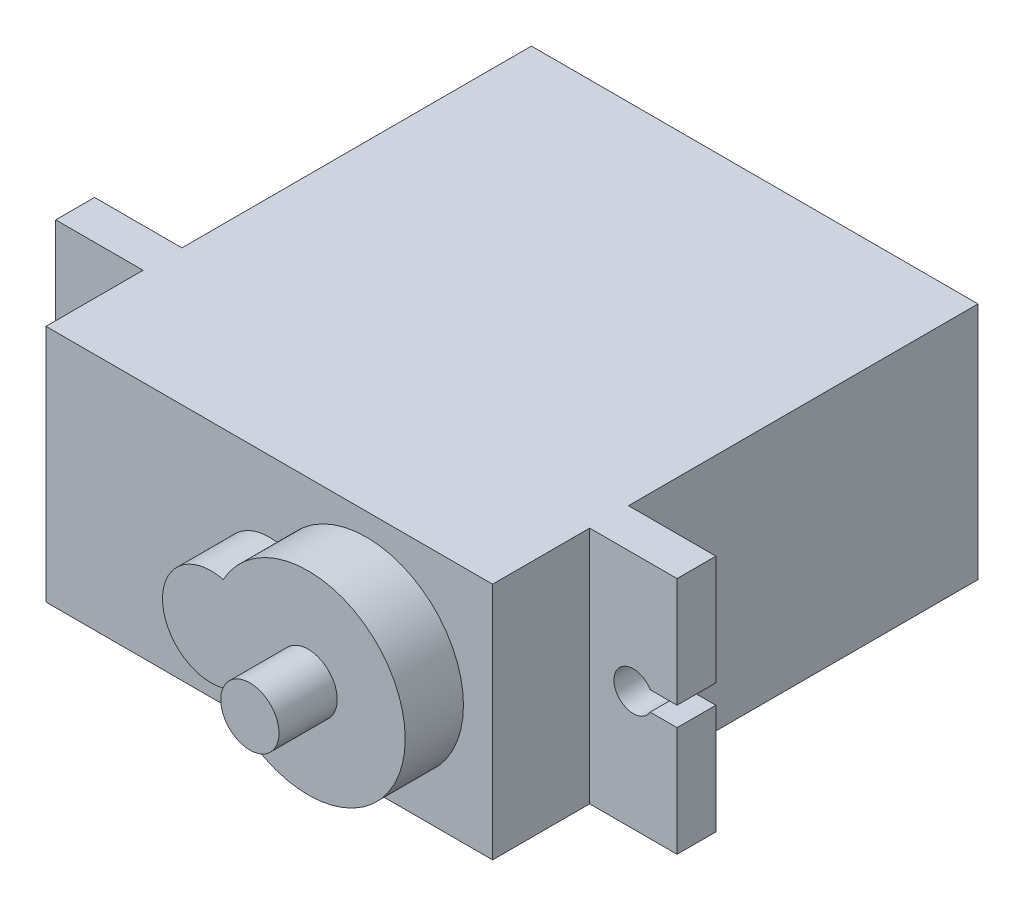
ISO-10303-21;
HEADER;
FILE_DESCRIPTION(('STEP AP214'),'2;1');
FILE_NAME('part.step','',(''),(''),'','','');
FILE_SCHEMA(('AUTOMOTIVE_DESIGN { 1 0 10303 214 1 1 1 1 }'));
ENDSEC;
DATA;
#1=APPLICATION_CONTEXT('core data for automotive mechanical design processes');
#2=APPLICATION_PROTOCOL_DEFINITION('international standard','automotive_design',2000,#1);
#3=PRODUCT_CONTEXT('',#1,'mechanical');
#4=PRODUCT('Part','Part','',(#3));
#5=PRODUCT_RELATED_PRODUCT_CATEGORY('part','',(#4));
#6=PRODUCT_DEFINITION_FORMATION('','',#4);
#7=PRODUCT_DEFINITION_CONTEXT('part definition',#1,'design');
#8=PRODUCT_DEFINITION('design','',#6,#7);
#9=PRODUCT_DEFINITION_SHAPE('','',#8);
#10=(LENGTH_UNIT() NAMED_UNIT(*) SI_UNIT(.MILLI.,.METRE.));
#11=(NAMED_UNIT(*) PLANE_ANGLE_UNIT() SI_UNIT($,.RADIAN.));
#12=(NAMED_UNIT(*) SI_UNIT($,.STERADIAN.) SOLID_ANGLE_UNIT());
#13=UNCERTAINTY_MEASURE_WITH_UNIT(LENGTH_MEASURE(1.E-05),#10,'distance_accuracy_value','');
#14=(GEOMETRIC_REPRESENTATION_CONTEXT(3) GLOBAL_UNCERTAINTY_ASSIGNED_CONTEXT((#13)) GLOBAL_UNIT_ASSIGNED_CONTEXT((#10,
#11,#12)) REPRESENTATION_CONTEXT('',''));
#15=CARTESIAN_POINT('',(0.,0.,0.));
#16=DIRECTION('',(0.,0.,1.));
#17=DIRECTION('',(1.,0.,0.));
#18=AXIS2_PLACEMENT_3D('',#15,#16,#17);
#19=CARTESIAN_POINT('',(-16.,6.15,18.));
#20=DIRECTION('',(-1.,0.,0.));
#21=DIRECTION('',(0.,-1.,0.));
#22=AXIS2_PLACEMENT_3D('',#19,#20,#21);
#23=PLANE('',#22);
#24=DIRECTION('',(0.,0.,1.));
#25=VECTOR('',#24,1.);
#26=CARTESIAN_POINT('',(-16.,0.5,10.));
#27=LINE('',#26,#25);
#28=CARTESIAN_POINT('',(-16.,0.5,18.));
#29=VERTEX_POINT('',#28);
#30=CARTESIAN_POINT('',(-16.,0.5,20.));
#31=VERTEX_POINT('',#30);
#32=EDGE_CURVE('E206',#29,#31,#27,.T.);
#33=ORIENTED_EDGE('',*,*,#32,.T.);
#34=DIRECTION('',(0.,-1.,0.));
#35=VECTOR('',#34,1.);
#36=CARTESIAN_POINT('',(-16.,6.15,20.));
#37=LINE('',#36,#35);
#38=CARTESIAN_POINT('',(-16.,6.15,20.));
#39=VERTEX_POINT('',#38);
#40=EDGE_CURVE('E226',#39,#31,#37,.T.);
#41=ORIENTED_EDGE('',*,*,#40,.F.);
#42=DIRECTION('',(0.,0.,1.));
#43=VECTOR('',#42,1.);
#44=CARTESIAN_POINT('',(-16.,6.15,18.));
#45=LINE('',#44,#43);
#46=CARTESIAN_POINT('',(-16.,6.15,18.));
#47=VERTEX_POINT('',#46);
#48=EDGE_CURVE('E243',#47,#39,#45,.T.);
#49=ORIENTED_EDGE('',*,*,#48,.F.);
#50=DIRECTION('',(0.,-1.,0.));
#51=VECTOR('',#50,1.);
#52=CARTESIAN_POINT('',(-16.,6.15,18.));
#53=LINE('',#52,#51);
#54=EDGE_CURVE('E408',#47,#29,#53,.T.);
#55=ORIENTED_EDGE('',*,*,#54,.T.);
#56=EDGE_LOOP('',(#33,#41,#49,#55));
#57=FACE_BOUND('',#56,.T.);
#58=ADVANCED_FACE('F47',(#57),#23,.T.);
#59=CARTESIAN_POINT('',(16.,-6.15,18.));
#60=DIRECTION('',(1.,0.,0.));
#61=DIRECTION('',(0.,0.,-1.));
#62=AXIS2_PLACEMENT_3D('',#59,#60,#61);
#63=PLANE('',#62);
#64=DIRECTION('',(0.,0.,1.));
#65=VECTOR('',#64,1.);
#66=CARTESIAN_POINT('',(16.,-0.499999999999996,10.));
#67=LINE('',#66,#65);
#68=CARTESIAN_POINT('',(16.,-0.499999999999996,18.));
#69=VERTEX_POINT('',#68);
#70=CARTESIAN_POINT('',(16.,-0.499999999999996,20.));
#71=VERTEX_POINT('',#70);
#72=EDGE_CURVE('E459',#69,#71,#67,.T.);
#73=ORIENTED_EDGE('',*,*,#72,.T.);
#74=DIRECTION('',(0.,1.,0.));
#75=VECTOR('',#74,1.);
#76=CARTESIAN_POINT('',(16.,-6.15,20.));
#77=LINE('',#76,#75);
#78=CARTESIAN_POINT('',(16.,-6.15,20.));
#79=VERTEX_POINT('',#78);
#80=EDGE_CURVE('E389',#79,#71,#77,.T.);
#81=ORIENTED_EDGE('',*,*,#80,.F.);
#82=DIRECTION('',(0.,0.,1.));
#83=VECTOR('',#82,1.);
#84=CARTESIAN_POINT('',(16.,-6.15,18.));
#85=LINE('',#84,#83);
#86=CARTESIAN_POINT('',(16.,-6.15,18.));
#87=VERTEX_POINT('',#86);
#88=EDGE_CURVE('E380',#87,#79,#85,.T.);
#89=ORIENTED_EDGE('',*,*,#88,.F.);
#90=DIRECTION('',(0.,1.,0.));
#91=VECTOR('',#90,1.);
#92=CARTESIAN_POINT('',(16.,-6.15,18.));
#93=LINE('',#92,#91);
#94=EDGE_CURVE('E372',#87,#69,#93,.T.);
#95=ORIENTED_EDGE('',*,*,#94,.T.);
#96=EDGE_LOOP('',(#73,#81,#89,#95));
#97=FACE_BOUND('',#96,.T.);
#98=ADVANCED_FACE('F480',(#97),#63,.T.);
#99=CARTESIAN_POINT('',(11.5,-6.15,25.));
#100=DIRECTION('',(-1.,0.,0.));
#101=DIRECTION('',(0.,0.,1.));
#102=AXIS2_PLACEMENT_3D('',#99,#100,#101);
#103=PLANE('',#102);
#104=DIRECTION('',(0.,-1.,0.));
#105=VECTOR('',#104,1.);
#106=CARTESIAN_POINT('',(11.5,-6.15,20.));
#107=LINE('',#106,#105);
#108=CARTESIAN_POINT('',(11.5,6.15,20.));
#109=VERTEX_POINT('',#108);
#110=CARTESIAN_POINT('',(11.5,-6.15,20.));
#111=VERTEX_POINT('',#110);
#112=EDGE_CURVE('E361',#109,#111,#107,.T.);
#113=ORIENTED_EDGE('',*,*,#112,.F.);
#114=DIRECTION('',(0.,0.,-1.));
#115=VECTOR('',#114,1.);
#116=CARTESIAN_POINT('',(11.5,6.15,25.));
#117=LINE('',#116,#115);
#118=CARTESIAN_POINT('',(11.5,6.15,25.));
#119=VERTEX_POINT('',#118);
#120=EDGE_CURVE('E256',#119,#109,#117,.T.);
#121=ORIENTED_EDGE('',*,*,#120,.F.);
#122=DIRECTION('',(0.,1.,0.));
#123=VECTOR('',#122,1.);
#124=CARTESIAN_POINT('',(11.5,-6.15,25.));
#125=LINE('',#124,#123);
#126=CARTESIAN_POINT('',(11.5,-6.15,25.));
#127=VERTEX_POINT('',#126);
#128=EDGE_CURVE('E280',#127,#119,#125,.T.);
#129=ORIENTED_EDGE('',*,*,#128,.F.);
#130=DIRECTION('',(0.,0.,-1.));
#131=VECTOR('',#130,1.);
#132=CARTESIAN_POINT('',(11.5,-6.15,25.));
#133=LINE('',#132,#131);
#134=EDGE_CURVE('E309',#127,#111,#133,.T.);
#135=ORIENTED_EDGE('',*,*,#134,.T.);
#136=EDGE_LOOP('',(#113,#121,#129,#135));
#137=FACE_BOUND('',#136,.T.);
#138=ADVANCED_FACE('F470',(#137),#103,.F.);
#139=CARTESIAN_POINT('',(-11.5,-6.15,25.));
#140=DIRECTION('',(1.,0.,0.));
#141=DIRECTION('',(0.,0.,-1.));
#142=AXIS2_PLACEMENT_3D('',#139,#140,#141);
#143=PLANE('',#142);
#144=DIRECTION('',(0.,1.,0.));
#145=VECTOR('',#144,1.);
#146=CARTESIAN_POINT('',(-11.5,6.15,20.));
#147=LINE('',#146,#145);
#148=CARTESIAN_POINT('',(-11.5,-6.15,20.));
#149=VERTEX_POINT('',#148);
#150=CARTESIAN_POINT('',(-11.5,6.15,20.));
#151=VERTEX_POINT('',#150);
#152=EDGE_CURVE('E233',#149,#151,#147,.T.);
#153=ORIENTED_EDGE('',*,*,#152,.F.);
#154=DIRECTION('',(0.,0.,-1.));
#155=VECTOR('',#154,1.);
#156=CARTESIAN_POINT('',(-11.5,-6.15,25.));
#157=LINE('',#156,#155);
#158=CARTESIAN_POINT('',(-11.5,-6.15,25.));
#159=VERTEX_POINT('',#158);
#160=EDGE_CURVE('E314',#159,#149,#157,.T.);
#161=ORIENTED_EDGE('',*,*,#160,.F.);
#162=DIRECTION('',(0.,-1.,0.));
#163=VECTOR('',#162,1.);
#164=CARTESIAN_POINT('',(-11.5,-6.15,25.));
#165=LINE('',#164,#163);
#166=CARTESIAN_POINT('',(-11.5,6.15,25.));
#167=VERTEX_POINT('',#166);
#168=EDGE_CURVE('E288',#167,#159,#165,.T.);
#169=ORIENTED_EDGE('',*,*,#168,.F.);
#170=DIRECTION('',(0.,0.,-1.));
#171=VECTOR('',#170,1.);
#172=CARTESIAN_POINT('',(-11.5,6.15,25.));
#173=LINE('',#172,#171);
#174=EDGE_CURVE('E319',#167,#151,#173,.T.);
#175=ORIENTED_EDGE('',*,*,#174,.T.);
#176=EDGE_LOOP('',(#153,#161,#169,#175));
#177=FACE_BOUND('',#176,.T.);
#178=ADVANCED_FACE('F421',(#177),#143,.F.);
#179=CARTESIAN_POINT('',(11.5,6.15,18.));
#180=VERTEX_POINT('',#179);
#181=CARTESIAN_POINT('',(11.5,6.15,0.));
#182=VERTEX_POINT('',#181);
#183=EDGE_CURVE('E323',#180,#182,#117,.T.);
#184=ORIENTED_EDGE('',*,*,#183,.F.);
#185=DIRECTION('',(0.,-1.,0.));
#186=VECTOR('',#185,1.);
#187=CARTESIAN_POINT('',(11.5,-6.15,18.));
#188=LINE('',#187,#186);
#189=CARTESIAN_POINT('',(11.5,-6.15,18.));
#190=VERTEX_POINT('',#189);
#191=EDGE_CURVE('E362',#180,#190,#188,.T.);
#192=ORIENTED_EDGE('',*,*,#191,.T.);
#193=CARTESIAN_POINT('',(11.5,-6.15,0.));
#194=VERTEX_POINT('',#193);
#195=EDGE_CURVE('E294',#190,#194,#133,.T.);
#196=ORIENTED_EDGE('',*,*,#195,.T.);
#197=DIRECTION('',(0.,1.,0.));
#198=VECTOR('',#197,1.);
#199=CARTESIAN_POINT('',(11.5,-6.15,0.));
#200=LINE('',#199,#198);
#201=EDGE_CURVE('E279',#194,#182,#200,.T.);
#202=ORIENTED_EDGE('',*,*,#201,.T.);
#203=EDGE_LOOP('',(#184,#192,#196,#202));
#204=FACE_BOUND('',#203,.T.);
#205=ADVANCED_FACE('F49',(#204),#103,.F.);
#206=CARTESIAN_POINT('',(-11.5,6.15,25.));
#207=DIRECTION('',(0.,-1.,0.));
#208=DIRECTION('',(0.,0.,-1.));
#209=AXIS2_PLACEMENT_3D('',#206,#207,#208);
#210=PLANE('',#209);
#211=DIRECTION('',(-1.,0.,0.));
#212=VECTOR('',#211,1.);
#213=CARTESIAN_POINT('',(-11.5,6.15,0.));
#214=LINE('',#213,#212);
#215=CARTESIAN_POINT('',(-11.5,6.15,0.));
#216=VERTEX_POINT('',#215);
#217=EDGE_CURVE('E298',#182,#216,#214,.T.);
#218=ORIENTED_EDGE('',*,*,#217,.T.);
#219=CARTESIAN_POINT('',(-11.5,6.15,18.));
#220=VERTEX_POINT('',#219);
#221=EDGE_CURVE('E318',#220,#216,#173,.T.);
#222=ORIENTED_EDGE('',*,*,#221,.F.);
#223=DIRECTION('',(-1.,0.,0.));
#224=VECTOR('',#223,1.);
#225=CARTESIAN_POINT('',(-11.5,6.15,18.));
#226=LINE('',#225,#224);
#227=EDGE_CURVE('E403',#220,#47,#226,.T.);
#228=ORIENTED_EDGE('',*,*,#227,.T.);
#229=ORIENTED_EDGE('',*,*,#48,.T.);
#230=DIRECTION('',(-1.,0.,0.));
#231=VECTOR('',#230,1.);
#232=CARTESIAN_POINT('',(-11.5,6.15,20.));
#233=LINE('',#232,#231);
#234=EDGE_CURVE('E227',#151,#39,#233,.T.);
#235=ORIENTED_EDGE('',*,*,#234,.F.);
#236=ORIENTED_EDGE('',*,*,#174,.F.);
#237=DIRECTION('',(-1.,0.,0.));
#238=VECTOR('',#237,1.);
#239=CARTESIAN_POINT('',(-11.5,6.15,25.));
#240=LINE('',#239,#238);
#241=EDGE_CURVE('E284',#119,#167,#240,.T.);
#242=ORIENTED_EDGE('',*,*,#241,.F.);
#243=ORIENTED_EDGE('',*,*,#120,.T.);
#244=DIRECTION('',(-1.,0.,0.));
#245=VECTOR('',#244,1.);
#246=CARTESIAN_POINT('',(11.5,6.15,20.));
#247=LINE('',#246,#245);
#248=CARTESIAN_POINT('',(16.,6.15,20.));
#249=VERTEX_POINT('',#248);
#250=EDGE_CURVE('E367',#249,#109,#247,.T.);
#251=ORIENTED_EDGE('',*,*,#250,.F.);
#252=DIRECTION('',(0.,0.,1.));
#253=VECTOR('',#252,1.);
#254=CARTESIAN_POINT('',(16.,6.15,18.));
#255=LINE('',#254,#253);
#256=CARTESIAN_POINT('',(16.,6.15,18.));
#257=VERTEX_POINT('',#256);
#258=EDGE_CURVE('E394',#257,#249,#255,.T.);
#259=ORIENTED_EDGE('',*,*,#258,.F.);
#260=DIRECTION('',(-1.,0.,0.));
#261=VECTOR('',#260,1.);
#262=CARTESIAN_POINT('',(11.5,6.15,18.));
#263=LINE('',#262,#261);
#264=EDGE_CURVE('E376',#257,#180,#263,.T.);
#265=ORIENTED_EDGE('',*,*,#264,.T.);
#266=ORIENTED_EDGE('',*,*,#183,.T.);
#267=EDGE_LOOP('',(#218,#222,#228,#229,#235,#236,#242,#243,#251,#259,#265,#266));
#268=FACE_BOUND('',#267,.T.);
#269=ADVANCED_FACE('F423',(#268),#210,.F.);
#270=CARTESIAN_POINT('',(-11.5,-6.15,18.));
#271=VERTEX_POINT('',#270);
#272=CARTESIAN_POINT('',(-11.5,-6.15,0.));
#273=VERTEX_POINT('',#272);
#274=EDGE_CURVE('E313',#271,#273,#157,.T.);
#275=ORIENTED_EDGE('',*,*,#274,.F.);
#276=DIRECTION('',(0.,1.,0.));
#277=VECTOR('',#276,1.);
#278=CARTESIAN_POINT('',(-11.5,6.15,18.));
#279=LINE('',#278,#277);
#280=EDGE_CURVE('E239',#271,#220,#279,.T.);
#281=ORIENTED_EDGE('',*,*,#280,.T.);
#282=ORIENTED_EDGE('',*,*,#221,.T.);
#283=DIRECTION('',(0.,-1.,0.));
#284=VECTOR('',#283,1.);
#285=CARTESIAN_POINT('',(-11.5,-6.15,0.));
#286=LINE('',#285,#284);
#287=EDGE_CURVE('E302',#216,#273,#286,.T.);
#288=ORIENTED_EDGE('',*,*,#287,.T.);
#289=EDGE_LOOP('',(#275,#281,#282,#288));
#290=FACE_BOUND('',#289,.T.);
#291=ADVANCED_FACE('F495',(#290),#143,.F.);
#292=CARTESIAN_POINT('',(-11.5,-6.15,25.));
#293=DIRECTION('',(0.,1.,0.));
#294=DIRECTION('',(0.,0.,1.));
#295=AXIS2_PLACEMENT_3D('',#292,#293,#294);
#296=PLANE('',#295);
#297=DIRECTION('',(1.,0.,0.));
#298=VECTOR('',#297,1.);
#299=CARTESIAN_POINT('',(-11.5,-6.15,0.));
#300=LINE('',#299,#298);
#301=EDGE_CURVE('E285',#273,#194,#300,.T.);
#302=ORIENTED_EDGE('',*,*,#301,.T.);
#303=ORIENTED_EDGE('',*,*,#195,.F.);
#304=DIRECTION('',(1.,0.,0.));
#305=VECTOR('',#304,1.);
#306=CARTESIAN_POINT('',(11.5,-6.15,18.));
#307=LINE('',#306,#305);
#308=EDGE_CURVE('E366',#190,#87,#307,.T.);
#309=ORIENTED_EDGE('',*,*,#308,.T.);
#310=ORIENTED_EDGE('',*,*,#88,.T.);
#311=DIRECTION('',(1.,0.,0.));
#312=VECTOR('',#311,1.);
#313=CARTESIAN_POINT('',(11.5,-6.15,20.));
#314=LINE('',#313,#312);
#315=EDGE_CURVE('E384',#111,#79,#314,.T.);
#316=ORIENTED_EDGE('',*,*,#315,.F.);
#317=ORIENTED_EDGE('',*,*,#134,.F.);
#318=DIRECTION('',(1.,0.,0.));
#319=VECTOR('',#318,1.);
#320=CARTESIAN_POINT('',(-11.5,-6.15,25.));
#321=LINE('',#320,#319);
#322=EDGE_CURVE('E291',#159,#127,#321,.T.);
#323=ORIENTED_EDGE('',*,*,#322,.F.);
#324=ORIENTED_EDGE('',*,*,#160,.T.);
#325=DIRECTION('',(1.,0.,0.));
#326=VECTOR('',#325,1.);
#327=CARTESIAN_POINT('',(-11.5,-6.15,20.));
#328=LINE('',#327,#326);
#329=CARTESIAN_POINT('',(-16.,-6.15,20.));
#330=VERTEX_POINT('',#329);
#331=EDGE_CURVE('E231',#330,#149,#328,.T.);
#332=ORIENTED_EDGE('',*,*,#331,.F.);
#333=DIRECTION('',(0.,0.,1.));
#334=VECTOR('',#333,1.);
#335=CARTESIAN_POINT('',(-16.,-6.15,18.));
#336=LINE('',#335,#334);
#337=CARTESIAN_POINT('',(-16.,-6.15,18.));
#338=VERTEX_POINT('',#337);
#339=EDGE_CURVE('E223',#338,#330,#336,.T.);
#340=ORIENTED_EDGE('',*,*,#339,.F.);
#341=DIRECTION('',(1.,0.,0.));
#342=VECTOR('',#341,1.);
#343=CARTESIAN_POINT('',(-11.5,-6.15,18.));
#344=LINE('',#343,#342);
#345=EDGE_CURVE('E246',#338,#271,#344,.T.);
#346=ORIENTED_EDGE('',*,*,#345,.T.);
#347=ORIENTED_EDGE('',*,*,#274,.T.);
#348=EDGE_LOOP('',(#302,#303,#309,#310,#316,#317,#323,#324,#332,#340,#346,#347));
#349=FACE_BOUND('',#348,.T.);
#350=ADVANCED_FACE('F474',(#349),#296,.F.);
#351=CARTESIAN_POINT('',(0.,0.,25.));
#352=DIRECTION('',(0.,0.,-1.));
#353=DIRECTION('',(-1.,0.,0.));
#354=AXIS2_PLACEMENT_3D('',#351,#352,#353);
#355=PLANE('',#354);
#356=CARTESIAN_POINT('',(5.,0.,25.));
#357=DIRECTION('',(0.,0.,1.));
#358=DIRECTION('',(1.,0.,0.));
#359=AXIS2_PLACEMENT_3D('',#356,#357,#358);
#360=CIRCLE('',#359,5.);
#361=CARTESIAN_POINT('',(0.624999999999998,-2.42061459137963,25.));
#362=VERTEX_POINT('',#361);
#363=CARTESIAN_POINT('',(0.624999999999998,2.42061459137963,25.));
#364=VERTEX_POINT('',#363);
#365=EDGE_CURVE('E250',#362,#364,#360,.T.);
#366=ORIENTED_EDGE('',*,*,#365,.F.);
#367=CARTESIAN_POINT('',(0.,0.,25.));
#368=DIRECTION('',(0.,0.,1.));
#369=DIRECTION('',(1.,0.,0.));
#370=AXIS2_PLACEMENT_3D('',#367,#368,#369);
#371=CIRCLE('',#370,2.5);
#372=EDGE_CURVE('E262',#364,#362,#371,.T.);
#373=ORIENTED_EDGE('',*,*,#372,.F.);
#374=EDGE_LOOP('',(#366,#373));
#375=FACE_BOUND('',#374,.T.);
#376=ORIENTED_EDGE('',*,*,#128,.T.);
#377=ORIENTED_EDGE('',*,*,#241,.T.);
#378=ORIENTED_EDGE('',*,*,#168,.T.);
#379=ORIENTED_EDGE('',*,*,#322,.T.);
#380=EDGE_LOOP('',(#376,#377,#378,#379));
#381=FACE_BOUND('',#380,.T.);
#382=ADVANCED_FACE('F504',(#375,#381),#355,.F.);
#383=CARTESIAN_POINT('',(0.,0.,0.));
#384=DIRECTION('',(0.,0.,-1.));
#385=DIRECTION('',(-1.,0.,0.));
#386=AXIS2_PLACEMENT_3D('',#383,#384,#385);
#387=PLANE('',#386);
#388=ORIENTED_EDGE('',*,*,#201,.F.);
#389=ORIENTED_EDGE('',*,*,#301,.F.);
#390=ORIENTED_EDGE('',*,*,#287,.F.);
#391=ORIENTED_EDGE('',*,*,#217,.F.);
#392=EDGE_LOOP('',(#388,#389,#390,#391));
#393=FACE_BOUND('',#392,.T.);
#394=ADVANCED_FACE('F501',(#393),#387,.T.);
#395=CARTESIAN_POINT('',(5.,0.,28.));
#396=DIRECTION('',(0.,0.,-1.));
#397=DIRECTION('',(-1.,0.,0.));
#398=AXIS2_PLACEMENT_3D('',#395,#396,#397);
#399=CYLINDRICAL_SURFACE('',#398,5.);
#400=ORIENTED_EDGE('',*,*,#365,.T.);
#401=DIRECTION('',(0.,0.,-1.));
#402=VECTOR('',#401,1.);
#403=CARTESIAN_POINT('',(0.624999999999998,2.42061459137963,28.));
#404=LINE('',#403,#402);
#405=CARTESIAN_POINT('',(0.624999999999998,2.42061459137963,28.));
#406=VERTEX_POINT('',#405);
#407=EDGE_CURVE('E275',#406,#364,#404,.T.);
#408=ORIENTED_EDGE('',*,*,#407,.F.);
#409=CARTESIAN_POINT('',(5.,0.,28.));
#410=DIRECTION('',(0.,0.,1.));
#411=DIRECTION('',(1.,0.,0.));
#412=AXIS2_PLACEMENT_3D('',#409,#410,#411);
#413=CIRCLE('',#412,5.);
#414=CARTESIAN_POINT('',(0.624999999999998,-2.42061459137963,28.));
#415=VERTEX_POINT('',#414);
#416=EDGE_CURVE('E257',#415,#406,#413,.T.);
#417=ORIENTED_EDGE('',*,*,#416,.F.);
#418=DIRECTION('',(0.,0.,-1.));
#419=VECTOR('',#418,1.);
#420=CARTESIAN_POINT('',(0.624999999999998,-2.42061459137963,28.));
#421=LINE('',#420,#419);
#422=EDGE_CURVE('E265',#415,#362,#421,.T.);
#423=ORIENTED_EDGE('',*,*,#422,.T.);
#424=EDGE_LOOP('',(#400,#408,#417,#423));
#425=FACE_BOUND('',#424,.T.);
#426=ADVANCED_FACE('F503',(#425),#399,.T.);
#427=CARTESIAN_POINT('',(0.,0.,28.));
#428=DIRECTION('',(0.,0.,-1.));
#429=DIRECTION('',(-1.,0.,0.));
#430=AXIS2_PLACEMENT_3D('',#427,#428,#429);
#431=CYLINDRICAL_SURFACE('',#430,2.5);
#432=ORIENTED_EDGE('',*,*,#372,.T.);
#433=ORIENTED_EDGE('',*,*,#422,.F.);
#434=CARTESIAN_POINT('',(0.,0.,28.));
#435=DIRECTION('',(0.,0.,1.));
#436=DIRECTION('',(1.,0.,0.));
#437=AXIS2_PLACEMENT_3D('',#434,#435,#436);
#438=CIRCLE('',#437,2.5);
#439=EDGE_CURVE('E261',#406,#415,#438,.T.);
#440=ORIENTED_EDGE('',*,*,#439,.F.);
#441=ORIENTED_EDGE('',*,*,#407,.T.);
#442=EDGE_LOOP('',(#432,#433,#440,#441));
#443=FACE_BOUND('',#442,.T.);
#444=ADVANCED_FACE('F510',(#443),#431,.T.);
#445=CARTESIAN_POINT('',(0.,0.,28.));
#446=DIRECTION('',(0.,0.,1.));
#447=DIRECTION('',(1.,0.,0.));
#448=AXIS2_PLACEMENT_3D('',#445,#446,#447);
#449=PLANE('',#448);
#450=CARTESIAN_POINT('',(5.,0.,28.));
#451=DIRECTION('',(0.,0.,1.));
#452=DIRECTION('',(1.,0.,0.));
#453=AXIS2_PLACEMENT_3D('',#450,#451,#452);
#454=CIRCLE('',#453,1.5);
#455=CARTESIAN_POINT('',(6.5,0.,28.));
#456=VERTEX_POINT('',#455);
#457=EDGE_CURVE('E251',#456,#456,#454,.T.);
#458=ORIENTED_EDGE('',*,*,#457,.F.);
#459=EDGE_LOOP('',(#458));
#460=FACE_BOUND('',#459,.T.);
#461=ORIENTED_EDGE('',*,*,#416,.T.);
#462=ORIENTED_EDGE('',*,*,#439,.T.);
#463=EDGE_LOOP('',(#461,#462));
#464=FACE_BOUND('',#463,.T.);
#465=ADVANCED_FACE('F536',(#460,#464),#449,.T.);
#466=CARTESIAN_POINT('',(5.,0.,31.));
#467=DIRECTION('',(0.,0.,-1.));
#468=DIRECTION('',(-1.,0.,0.));
#469=AXIS2_PLACEMENT_3D('',#466,#467,#468);
#470=CYLINDRICAL_SURFACE('',#469,1.5);
#471=CARTESIAN_POINT('',(5.,0.,31.));
#472=DIRECTION('',(0.,0.,1.));
#473=DIRECTION('',(1.,0.,0.));
#474=AXIS2_PLACEMENT_3D('',#471,#472,#473);
#475=CIRCLE('',#474,1.5);
#476=CARTESIAN_POINT('',(6.5,0.,31.));
#477=VERTEX_POINT('',#476);
#478=EDGE_CURVE('E242',#477,#477,#475,.T.);
#479=ORIENTED_EDGE('',*,*,#478,.F.);
#480=EDGE_LOOP('',(#479));
#481=FACE_BOUND('',#480,.T.);
#482=ORIENTED_EDGE('',*,*,#457,.T.);
#483=EDGE_LOOP('',(#482));
#484=FACE_BOUND('',#483,.T.);
#485=ADVANCED_FACE('F531',(#481,#484),#470,.T.);
#486=CARTESIAN_POINT('',(5.,0.,31.));
#487=DIRECTION('',(0.,0.,1.));
#488=DIRECTION('',(1.,0.,0.));
#489=AXIS2_PLACEMENT_3D('',#486,#487,#488);
#490=PLANE('',#489);
#491=ORIENTED_EDGE('',*,*,#478,.T.);
#492=EDGE_LOOP('',(#491));
#493=FACE_BOUND('',#492,.T.);
#494=ADVANCED_FACE('F525',(#493),#490,.T.);
#495=DIRECTION('',(0.,0.,1.));
#496=VECTOR('',#495,1.);
#497=CARTESIAN_POINT('',(-16.,-0.5,10.));
#498=LINE('',#497,#496);
#499=CARTESIAN_POINT('',(-16.,-0.5,18.));
#500=VERTEX_POINT('',#499);
#501=CARTESIAN_POINT('',(-16.,-0.5,20.));
#502=VERTEX_POINT('',#501);
#503=EDGE_CURVE('E195',#500,#502,#498,.T.);
#504=ORIENTED_EDGE('',*,*,#503,.F.);
#505=EDGE_CURVE('E407',#500,#338,#53,.T.);
#506=ORIENTED_EDGE('',*,*,#505,.T.);
#507=ORIENTED_EDGE('',*,*,#339,.T.);
#508=EDGE_CURVE('E213',#502,#330,#37,.T.);
#509=ORIENTED_EDGE('',*,*,#508,.F.);
#510=EDGE_LOOP('',(#504,#506,#507,#509));
#511=FACE_BOUND('',#510,.T.);
#512=ADVANCED_FACE('F221',(#511),#23,.T.);
#513=CARTESIAN_POINT('',(0.,0.,18.));
#514=DIRECTION('',(0.,0.,-1.));
#515=DIRECTION('',(-1.,0.,0.));
#516=AXIS2_PLACEMENT_3D('',#513,#514,#515);
#517=PLANE('',#516);
#518=DIRECTION('',(1.,0.,0.));
#519=VECTOR('',#518,1.);
#520=CARTESIAN_POINT('',(0.,0.5,18.));
#521=LINE('',#520,#519);
#522=CARTESIAN_POINT('',(-14.6160254037844,0.499999999999997,18.));
#523=VERTEX_POINT('',#522);
#524=EDGE_CURVE('E440',#29,#523,#521,.T.);
#525=ORIENTED_EDGE('',*,*,#524,.F.);
#526=ORIENTED_EDGE('',*,*,#54,.F.);
#527=ORIENTED_EDGE('',*,*,#227,.F.);
#528=ORIENTED_EDGE('',*,*,#280,.F.);
#529=ORIENTED_EDGE('',*,*,#345,.F.);
#530=ORIENTED_EDGE('',*,*,#505,.F.);
#531=DIRECTION('',(-1.,0.,0.));
#532=VECTOR('',#531,1.);
#533=CARTESIAN_POINT('',(0.,-0.5,18.));
#534=LINE('',#533,#532);
#535=CARTESIAN_POINT('',(-14.6160254037844,-0.5,18.));
#536=VERTEX_POINT('',#535);
#537=EDGE_CURVE('E201',#536,#500,#534,.T.);
#538=ORIENTED_EDGE('',*,*,#537,.F.);
#539=CARTESIAN_POINT('',(-13.75,0.,18.));
#540=DIRECTION('',(0.,0.,-1.));
#541=DIRECTION('',(-1.,0.,0.));
#542=AXIS2_PLACEMENT_3D('',#539,#540,#541);
#543=CIRCLE('',#542,1.);
#544=EDGE_CURVE('E357',#523,#536,#543,.T.);
#545=ORIENTED_EDGE('',*,*,#544,.F.);
#546=EDGE_LOOP('',(#525,#526,#527,#528,#529,#530,#538,#545));
#547=FACE_BOUND('',#546,.T.);
#548=ADVANCED_FACE('F437',(#547),#517,.T.);
#549=CARTESIAN_POINT('',(0.,0.,20.));
#550=DIRECTION('',(0.,0.,-1.));
#551=DIRECTION('',(-1.,0.,0.));
#552=AXIS2_PLACEMENT_3D('',#549,#550,#551);
#553=PLANE('',#552);
#554=ORIENTED_EDGE('',*,*,#40,.T.);
#555=DIRECTION('',(-1.,0.,0.));
#556=VECTOR('',#555,1.);
#557=CARTESIAN_POINT('',(-16.,0.5,20.));
#558=LINE('',#557,#556);
#559=CARTESIAN_POINT('',(-14.6160254037844,0.5,20.));
#560=VERTEX_POINT('',#559);
#561=EDGE_CURVE('E207',#560,#31,#558,.T.);
#562=ORIENTED_EDGE('',*,*,#561,.F.);
#563=CARTESIAN_POINT('',(-13.75,0.,20.));
#564=DIRECTION('',(0.,0.,1.));
#565=DIRECTION('',(1.,0.,0.));
#566=AXIS2_PLACEMENT_3D('',#563,#564,#565);
#567=CIRCLE('',#566,1.);
#568=CARTESIAN_POINT('',(-14.6160254037844,-0.500000000000001,20.));
#569=VERTEX_POINT('',#568);
#570=EDGE_CURVE('E217',#569,#560,#567,.T.);
#571=ORIENTED_EDGE('',*,*,#570,.F.);
#572=DIRECTION('',(1.,0.,0.));
#573=VECTOR('',#572,1.);
#574=CARTESIAN_POINT('',(-14.6160254037844,-0.5,20.));
#575=LINE('',#574,#573);
#576=EDGE_CURVE('E198',#502,#569,#575,.T.);
#577=ORIENTED_EDGE('',*,*,#576,.F.);
#578=ORIENTED_EDGE('',*,*,#508,.T.);
#579=ORIENTED_EDGE('',*,*,#331,.T.);
#580=ORIENTED_EDGE('',*,*,#152,.T.);
#581=ORIENTED_EDGE('',*,*,#234,.T.);
#582=EDGE_LOOP('',(#554,#562,#571,#577,#578,#579,#580,#581));
#583=FACE_BOUND('',#582,.T.);
#584=ADVANCED_FACE('F212',(#583),#553,.F.);
#585=DIRECTION('',(0.,0.,1.));
#586=VECTOR('',#585,1.);
#587=CARTESIAN_POINT('',(16.,0.500000000000004,10.));
#588=LINE('',#587,#586);
#589=CARTESIAN_POINT('',(16.,0.500000000000004,18.));
#590=VERTEX_POINT('',#589);
#591=CARTESIAN_POINT('',(16.,0.500000000000004,20.));
#592=VERTEX_POINT('',#591);
#593=EDGE_CURVE('E452',#590,#592,#588,.T.);
#594=ORIENTED_EDGE('',*,*,#593,.F.);
#595=EDGE_CURVE('E371',#590,#257,#93,.T.);
#596=ORIENTED_EDGE('',*,*,#595,.T.);
#597=ORIENTED_EDGE('',*,*,#258,.T.);
#598=EDGE_CURVE('E388',#592,#249,#77,.T.);
#599=ORIENTED_EDGE('',*,*,#598,.F.);
#600=EDGE_LOOP('',(#594,#596,#597,#599));
#601=FACE_BOUND('',#600,.T.);
#602=ADVANCED_FACE('F456',(#601),#63,.T.);
#603=CARTESIAN_POINT('',(0.,0.,18.));
#604=DIRECTION('',(0.,0.,-1.));
#605=DIRECTION('',(-1.,0.,0.));
#606=AXIS2_PLACEMENT_3D('',#603,#604,#605);
#607=PLANE('',#606);
#608=DIRECTION('',(-1.,0.,0.));
#609=VECTOR('',#608,1.);
#610=CARTESIAN_POINT('',(0.,-0.5,18.));
#611=LINE('',#610,#609);
#612=CARTESIAN_POINT('',(14.6160254037844,-0.499999999999997,18.));
#613=VERTEX_POINT('',#612);
#614=EDGE_CURVE('E71',#69,#613,#611,.T.);
#615=ORIENTED_EDGE('',*,*,#614,.F.);
#616=ORIENTED_EDGE('',*,*,#94,.F.);
#617=ORIENTED_EDGE('',*,*,#308,.F.);
#618=ORIENTED_EDGE('',*,*,#191,.F.);
#619=ORIENTED_EDGE('',*,*,#264,.F.);
#620=ORIENTED_EDGE('',*,*,#595,.F.);
#621=DIRECTION('',(1.,0.,0.));
#622=VECTOR('',#621,1.);
#623=CARTESIAN_POINT('',(0.,0.5,18.));
#624=LINE('',#623,#622);
#625=CARTESIAN_POINT('',(14.6160254037844,0.500000000000004,18.));
#626=VERTEX_POINT('',#625);
#627=EDGE_CURVE('E352',#626,#590,#624,.T.);
#628=ORIENTED_EDGE('',*,*,#627,.F.);
#629=CARTESIAN_POINT('',(13.75,0.,18.));
#630=DIRECTION('',(0.,0.,-1.));
#631=DIRECTION('',(-1.,0.,0.));
#632=AXIS2_PLACEMENT_3D('',#629,#630,#631);
#633=CIRCLE('',#632,1.);
#634=EDGE_CURVE('E340',#613,#626,#633,.T.);
#635=ORIENTED_EDGE('',*,*,#634,.F.);
#636=EDGE_LOOP('',(#615,#616,#617,#618,#619,#620,#628,#635));
#637=FACE_BOUND('',#636,.T.);
#638=ADVANCED_FACE('F462',(#637),#607,.T.);
#639=CARTESIAN_POINT('',(0.,0.,20.));
#640=DIRECTION('',(0.,0.,-1.));
#641=DIRECTION('',(-1.,0.,0.));
#642=AXIS2_PLACEMENT_3D('',#639,#640,#641);
#643=PLANE('',#642);
#644=ORIENTED_EDGE('',*,*,#80,.T.);
#645=DIRECTION('',(1.,0.,0.));
#646=VECTOR('',#645,1.);
#647=CARTESIAN_POINT('',(14.6160254037844,-0.499999999999996,20.));
#648=LINE('',#647,#646);
#649=CARTESIAN_POINT('',(14.6160254037844,-0.499999999999996,20.));
#650=VERTEX_POINT('',#649);
#651=EDGE_CURVE('E219',#650,#71,#648,.T.);
#652=ORIENTED_EDGE('',*,*,#651,.F.);
#653=CARTESIAN_POINT('',(13.75,0.,20.));
#654=DIRECTION('',(0.,0.,1.));
#655=DIRECTION('',(-1.,0.,0.));
#656=AXIS2_PLACEMENT_3D('',#653,#654,#655);
#657=CIRCLE('',#656,1.);
#658=CARTESIAN_POINT('',(14.6160254037844,0.500000000000001,20.));
#659=VERTEX_POINT('',#658);
#660=EDGE_CURVE('E338',#659,#650,#657,.T.);
#661=ORIENTED_EDGE('',*,*,#660,.F.);
#662=DIRECTION('',(-1.,0.,0.));
#663=VECTOR('',#662,1.);
#664=CARTESIAN_POINT('',(16.,0.500000000000004,20.));
#665=LINE('',#664,#663);
#666=EDGE_CURVE('E63',#592,#659,#665,.T.);
#667=ORIENTED_EDGE('',*,*,#666,.F.);
#668=ORIENTED_EDGE('',*,*,#598,.T.);
#669=ORIENTED_EDGE('',*,*,#250,.T.);
#670=ORIENTED_EDGE('',*,*,#112,.T.);
#671=ORIENTED_EDGE('',*,*,#315,.T.);
#672=EDGE_LOOP('',(#644,#652,#661,#667,#668,#669,#670,#671));
#673=FACE_BOUND('',#672,.T.);
#674=ADVANCED_FACE('F345',(#673),#643,.F.);
#675=CARTESIAN_POINT('',(13.75,0.,17.));
#676=DIRECTION('',(0.,0.,1.));
#677=DIRECTION('',(1.,0.,0.));
#678=AXIS2_PLACEMENT_3D('',#675,#676,#677);
#679=CYLINDRICAL_SURFACE('',#678,1.);
#680=ORIENTED_EDGE('',*,*,#660,.T.);
#681=DIRECTION('',(0.,0.,1.));
#682=VECTOR('',#681,1.);
#683=CARTESIAN_POINT('',(14.6160254037844,-0.499999999999997,17.));
#684=LINE('',#683,#682);
#685=EDGE_CURVE('E11',#650,#613,#684,.F.);
#686=ORIENTED_EDGE('',*,*,#685,.T.);
#687=ORIENTED_EDGE('',*,*,#634,.T.);
#688=DIRECTION('',(0.,0.,1.));
#689=VECTOR('',#688,1.);
#690=CARTESIAN_POINT('',(14.6160254037844,0.500000000000004,17.));
#691=LINE('',#690,#689);
#692=EDGE_CURVE('E56',#626,#659,#691,.T.);
#693=ORIENTED_EDGE('',*,*,#692,.T.);
#694=EDGE_LOOP('',(#680,#686,#687,#693));
#695=FACE_BOUND('',#694,.T.);
#696=ADVANCED_FACE('F337',(#695),#679,.F.);
#697=CARTESIAN_POINT('',(-13.75,0.,17.));
#698=DIRECTION('',(0.,0.,1.));
#699=DIRECTION('',(1.,0.,0.));
#700=AXIS2_PLACEMENT_3D('',#697,#698,#699);
#701=CYLINDRICAL_SURFACE('',#700,1.);
#702=ORIENTED_EDGE('',*,*,#570,.T.);
#703=DIRECTION('',(0.,0.,1.));
#704=VECTOR('',#703,1.);
#705=CARTESIAN_POINT('',(-14.6160254037844,0.499999999999997,17.));
#706=LINE('',#705,#704);
#707=EDGE_CURVE('E329',#560,#523,#706,.F.);
#708=ORIENTED_EDGE('',*,*,#707,.T.);
#709=ORIENTED_EDGE('',*,*,#544,.T.);
#710=DIRECTION('',(0.,0.,1.));
#711=VECTOR('',#710,1.);
#712=CARTESIAN_POINT('',(-14.6160254037844,-0.5,17.));
#713=LINE('',#712,#711);
#714=EDGE_CURVE('E255',#536,#569,#713,.T.);
#715=ORIENTED_EDGE('',*,*,#714,.T.);
#716=EDGE_LOOP('',(#702,#708,#709,#715));
#717=FACE_BOUND('',#716,.T.);
#718=ADVANCED_FACE('F433',(#717),#701,.F.);
#719=CARTESIAN_POINT('',(-14.6160254037844,-0.5,10.));
#720=DIRECTION('',(0.,-1.,0.));
#721=DIRECTION('',(0.,0.,-1.));
#722=AXIS2_PLACEMENT_3D('',#719,#720,#721);
#723=PLANE('',#722);
#724=ORIENTED_EDGE('',*,*,#537,.T.);
#725=ORIENTED_EDGE('',*,*,#503,.T.);
#726=ORIENTED_EDGE('',*,*,#576,.T.);
#727=ORIENTED_EDGE('',*,*,#714,.F.);
#728=EDGE_LOOP('',(#724,#725,#726,#727));
#729=FACE_BOUND('',#728,.T.);
#730=ADVANCED_FACE('F197',(#729),#723,.F.);
#731=CARTESIAN_POINT('',(-16.,0.5,10.));
#732=DIRECTION('',(0.,1.,0.));
#733=DIRECTION('',(0.,0.,1.));
#734=AXIS2_PLACEMENT_3D('',#731,#732,#733);
#735=PLANE('',#734);
#736=ORIENTED_EDGE('',*,*,#524,.T.);
#737=ORIENTED_EDGE('',*,*,#707,.F.);
#738=ORIENTED_EDGE('',*,*,#561,.T.);
#739=ORIENTED_EDGE('',*,*,#32,.F.);
#740=EDGE_LOOP('',(#736,#737,#738,#739));
#741=FACE_BOUND('',#740,.T.);
#742=ADVANCED_FACE('F703',(#741),#735,.F.);
#743=CARTESIAN_POINT('',(16.,0.500000000000004,10.));
#744=DIRECTION('',(0.,1.,0.));
#745=DIRECTION('',(-1.,0.,0.));
#746=AXIS2_PLACEMENT_3D('',#743,#744,#745);
#747=PLANE('',#746);
#748=ORIENTED_EDGE('',*,*,#627,.T.);
#749=ORIENTED_EDGE('',*,*,#593,.T.);
#750=ORIENTED_EDGE('',*,*,#666,.T.);
#751=ORIENTED_EDGE('',*,*,#692,.F.);
#752=EDGE_LOOP('',(#748,#749,#750,#751));
#753=FACE_BOUND('',#752,.T.);
#754=ADVANCED_FACE('F451',(#753),#747,.F.);
#755=CARTESIAN_POINT('',(14.6160254037844,-0.499999999999996,10.));
#756=DIRECTION('',(0.,-1.,0.));
#757=DIRECTION('',(1.,0.,0.));
#758=AXIS2_PLACEMENT_3D('',#755,#756,#757);
#759=PLANE('',#758);
#760=ORIENTED_EDGE('',*,*,#614,.T.);
#761=ORIENTED_EDGE('',*,*,#685,.F.);
#762=ORIENTED_EDGE('',*,*,#651,.T.);
#763=ORIENTED_EDGE('',*,*,#72,.F.);
#764=EDGE_LOOP('',(#760,#761,#762,#763));
#765=FACE_BOUND('',#764,.T.);
#766=ADVANCED_FACE('F485',(#765),#759,.F.);
#767=CLOSED_SHELL('',(#58,#98,#138,#178,#205,#269,#291,#350,#382,#394,#426,#444,#465,#485,#494,
#512,#548,#584,#602,#638,#674,#696,#718,#730,#742,#754,#766));
#768=MANIFOLD_SOLID_BREP('B2',#767);
#769=ADVANCED_BREP_SHAPE_REPRESENTATION('',(#18,#768),#14);
#770=SHAPE_DEFINITION_REPRESENTATION(#9,#769);
ENDSEC;
END-ISO-10303-21;
